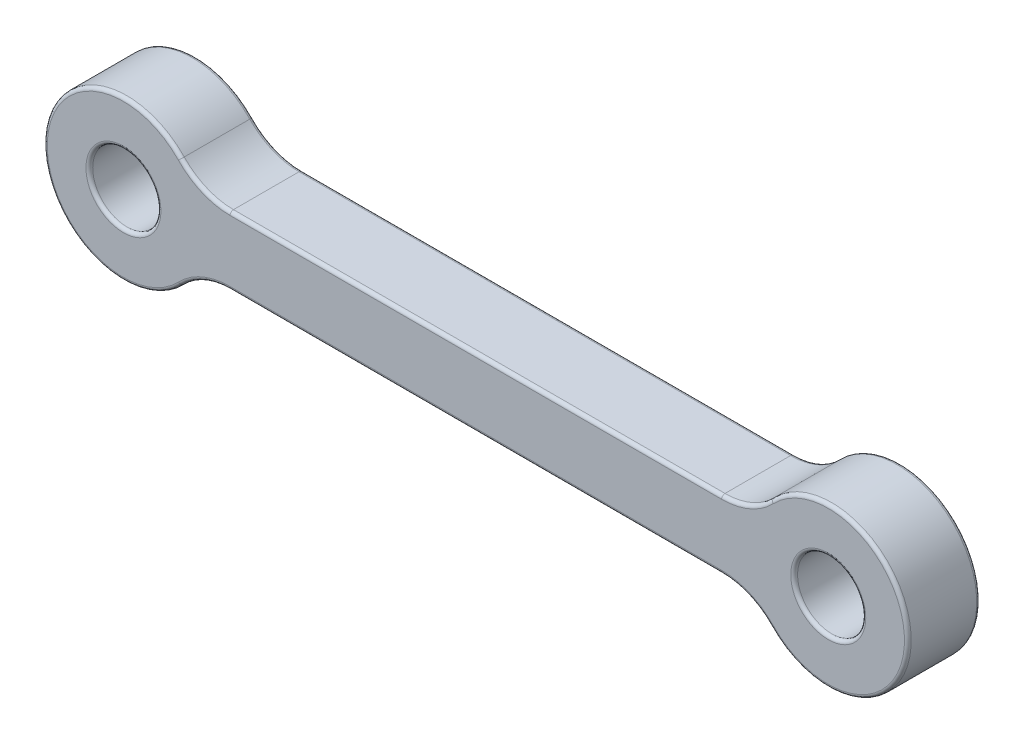
ISO-10303-21;
HEADER;
FILE_DESCRIPTION(('STEP AP214'),'2;1');
FILE_NAME('part.step','',(''),(''),'','','');
FILE_SCHEMA(('AUTOMOTIVE_DESIGN { 1 0 10303 214 1 1 1 1 }'));
ENDSEC;
DATA;
#1=APPLICATION_CONTEXT('core data for automotive mechanical design processes');
#2=APPLICATION_PROTOCOL_DEFINITION('international standard','automotive_design',2000,#1);
#3=PRODUCT_CONTEXT('',#1,'mechanical');
#4=PRODUCT('Part','Part','',(#3));
#5=PRODUCT_RELATED_PRODUCT_CATEGORY('part','',(#4));
#6=PRODUCT_DEFINITION_FORMATION('','',#4);
#7=PRODUCT_DEFINITION_CONTEXT('part definition',#1,'design');
#8=PRODUCT_DEFINITION('design','',#6,#7);
#9=PRODUCT_DEFINITION_SHAPE('','',#8);
#10=(LENGTH_UNIT() NAMED_UNIT(*) SI_UNIT(.MILLI.,.METRE.));
#11=(NAMED_UNIT(*) PLANE_ANGLE_UNIT() SI_UNIT($,.RADIAN.));
#12=(NAMED_UNIT(*) SI_UNIT($,.STERADIAN.) SOLID_ANGLE_UNIT());
#13=UNCERTAINTY_MEASURE_WITH_UNIT(LENGTH_MEASURE(1.E-05),#10,'distance_accuracy_value','');
#14=(GEOMETRIC_REPRESENTATION_CONTEXT(3) GLOBAL_UNCERTAINTY_ASSIGNED_CONTEXT((#13)) GLOBAL_UNIT_ASSIGNED_CONTEXT((#10,
#11,#12)) REPRESENTATION_CONTEXT('',''));
#15=CARTESIAN_POINT('',(0.,0.,0.));
#16=DIRECTION('',(0.,0.,1.));
#17=DIRECTION('',(1.,0.,0.));
#18=AXIS2_PLACEMENT_3D('',#15,#16,#17);
#19=CARTESIAN_POINT('',(0.,1.5,3.18));
#20=DIRECTION('',(0.,-1.,0.));
#21=DIRECTION('',(0.,0.,-1.));
#22=AXIS2_PLACEMENT_3D('',#19,#20,#21);
#23=PLANE('',#22);
#24=DIRECTION('',(0.,0.,1.));
#25=VECTOR('',#24,1.);
#26=CARTESIAN_POINT('',(4.69041575982343,1.5,3.18));
#27=LINE('',#26,#25);
#28=CARTESIAN_POINT('',(4.69041575982343,1.5,0.15));
#29=VERTEX_POINT('',#28);
#30=CARTESIAN_POINT('',(4.69041575982343,1.5,3.03));
#31=VERTEX_POINT('',#30);
#32=EDGE_CURVE('E262',#29,#31,#27,.T.);
#33=ORIENTED_EDGE('',*,*,#32,.T.);
#34=DIRECTION('',(-1.,0.,0.));
#35=VECTOR('',#34,1.);
#36=CARTESIAN_POINT('',(26.3095842401766,1.5,3.03));
#37=LINE('',#36,#35);
#38=CARTESIAN_POINT('',(26.3095842401766,1.5,3.03));
#39=VERTEX_POINT('',#38);
#40=EDGE_CURVE('E219',#31,#39,#37,.F.);
#41=ORIENTED_EDGE('',*,*,#40,.T.);
#42=DIRECTION('',(0.,0.,-1.));
#43=VECTOR('',#42,1.);
#44=CARTESIAN_POINT('',(26.3095842401766,1.5,3.18));
#45=LINE('',#44,#43);
#46=CARTESIAN_POINT('',(26.3095842401766,1.5,0.15));
#47=VERTEX_POINT('',#46);
#48=EDGE_CURVE('E306',#39,#47,#45,.T.);
#49=ORIENTED_EDGE('',*,*,#48,.T.);
#50=DIRECTION('',(-1.,0.,0.));
#51=VECTOR('',#50,1.);
#52=CARTESIAN_POINT('',(0.,1.5,0.15));
#53=LINE('',#52,#51);
#54=EDGE_CURVE('E217',#47,#29,#53,.T.);
#55=ORIENTED_EDGE('',*,*,#54,.T.);
#56=EDGE_LOOP('',(#33,#41,#49,#55));
#57=FACE_BOUND('',#56,.T.);
#58=ADVANCED_FACE('F33',(#57),#23,.F.);
#59=CARTESIAN_POINT('',(0.,0.,3.18));
#60=DIRECTION('',(0.,0.,-1.));
#61=DIRECTION('',(-1.,0.,0.));
#62=AXIS2_PLACEMENT_3D('',#59,#60,#61);
#63=CYLINDRICAL_SURFACE('',#62,3.5);
#64=DIRECTION('',(0.,0.,-1.));
#65=VECTOR('',#64,1.);
#66=CARTESIAN_POINT('',(2.52560848605877,-2.42307692307692,3.18));
#67=LINE('',#66,#65);
#68=CARTESIAN_POINT('',(2.52560848605877,-2.42307692307692,0.150000000000001));
#69=VERTEX_POINT('',#68);
#70=CARTESIAN_POINT('',(2.52560848605877,-2.42307692307692,3.03));
#71=VERTEX_POINT('',#70);
#72=EDGE_CURVE('E308',#69,#71,#67,.F.);
#73=ORIENTED_EDGE('',*,*,#72,.T.);
#74=CARTESIAN_POINT('',(0.,0.,3.03));
#75=DIRECTION('',(0.,0.,1.));
#76=DIRECTION('',(1.,0.,0.));
#77=AXIS2_PLACEMENT_3D('',#74,#75,#76);
#78=CIRCLE('',#77,3.5);
#79=CARTESIAN_POINT('',(2.52560848605877,2.42307692307692,3.03));
#80=VERTEX_POINT('',#79);
#81=EDGE_CURVE('E210',#71,#80,#78,.F.);
#82=ORIENTED_EDGE('',*,*,#81,.T.);
#83=DIRECTION('',(0.,0.,-1.));
#84=VECTOR('',#83,1.);
#85=CARTESIAN_POINT('',(2.52560848605877,2.42307692307692,3.18));
#86=LINE('',#85,#84);
#87=CARTESIAN_POINT('',(2.52560848605877,2.42307692307692,0.150000000000001));
#88=VERTEX_POINT('',#87);
#89=EDGE_CURVE('E316',#80,#88,#86,.T.);
#90=ORIENTED_EDGE('',*,*,#89,.T.);
#91=CARTESIAN_POINT('',(0.,0.,0.15));
#92=DIRECTION('',(0.,0.,1.));
#93=DIRECTION('',(1.,0.,0.));
#94=AXIS2_PLACEMENT_3D('',#91,#92,#93);
#95=CIRCLE('',#94,3.5);
#96=EDGE_CURVE('E208',#88,#69,#95,.T.);
#97=ORIENTED_EDGE('',*,*,#96,.T.);
#98=EDGE_LOOP('',(#73,#82,#90,#97));
#99=FACE_BOUND('',#98,.T.);
#100=ADVANCED_FACE('F385',(#99),#63,.T.);
#101=CARTESIAN_POINT('',(0.,-1.5,3.18));
#102=DIRECTION('',(0.,-1.,0.));
#103=DIRECTION('',(0.,0.,-1.));
#104=AXIS2_PLACEMENT_3D('',#101,#102,#103);
#105=PLANE('',#104);
#106=DIRECTION('',(0.,0.,1.));
#107=VECTOR('',#106,1.);
#108=CARTESIAN_POINT('',(26.3095842401766,-1.5,3.18));
#109=LINE('',#108,#107);
#110=CARTESIAN_POINT('',(26.3095842401766,-1.5,0.15));
#111=VERTEX_POINT('',#110);
#112=CARTESIAN_POINT('',(26.3095842401766,-1.5,3.03));
#113=VERTEX_POINT('',#112);
#114=EDGE_CURVE('E168',#111,#113,#109,.T.);
#115=ORIENTED_EDGE('',*,*,#114,.T.);
#116=DIRECTION('',(-1.,0.,0.));
#117=VECTOR('',#116,1.);
#118=CARTESIAN_POINT('',(0.,-1.5,3.03));
#119=LINE('',#118,#117);
#120=CARTESIAN_POINT('',(4.69041575982343,-1.5,3.03));
#121=VERTEX_POINT('',#120);
#122=EDGE_CURVE('E202',#113,#121,#119,.T.);
#123=ORIENTED_EDGE('',*,*,#122,.T.);
#124=DIRECTION('',(0.,0.,-1.));
#125=VECTOR('',#124,1.);
#126=CARTESIAN_POINT('',(4.69041575982343,-1.5,3.18));
#127=LINE('',#126,#125);
#128=CARTESIAN_POINT('',(4.69041575982343,-1.5,0.15));
#129=VERTEX_POINT('',#128);
#130=EDGE_CURVE('E319',#121,#129,#127,.T.);
#131=ORIENTED_EDGE('',*,*,#130,.T.);
#132=DIRECTION('',(-1.,0.,0.));
#133=VECTOR('',#132,1.);
#134=CARTESIAN_POINT('',(26.3095842401766,-1.5,0.15));
#135=LINE('',#134,#133);
#136=EDGE_CURVE('E200',#129,#111,#135,.F.);
#137=ORIENTED_EDGE('',*,*,#136,.T.);
#138=EDGE_LOOP('',(#115,#123,#131,#137));
#139=FACE_BOUND('',#138,.T.);
#140=ADVANCED_FACE('F341',(#139),#105,.T.);
#141=CARTESIAN_POINT('',(0.,0.,3.18));
#142=DIRECTION('',(0.,0.,-1.));
#143=DIRECTION('',(-1.,0.,0.));
#144=AXIS2_PLACEMENT_3D('',#141,#142,#143);
#145=CYLINDRICAL_SURFACE('',#144,1.5);
#146=CARTESIAN_POINT('',(0.,0.,3.03));
#147=DIRECTION('',(0.,0.,1.));
#148=DIRECTION('',(1.,0.,0.));
#149=AXIS2_PLACEMENT_3D('',#146,#147,#148);
#150=CIRCLE('',#149,1.5);
#151=CARTESIAN_POINT('',(-1.5,0.,3.03));
#152=VERTEX_POINT('',#151);
#153=EDGE_CURVE('E194',#152,#152,#150,.T.);
#154=CARTESIAN_POINT('',(0.,0.,0.15));
#155=DIRECTION('',(0.,0.,1.));
#156=DIRECTION('',(1.,0.,0.));
#157=AXIS2_PLACEMENT_3D('',#154,#155,#156);
#158=CIRCLE('',#157,1.5);
#159=CARTESIAN_POINT('',(-1.5,0.,0.15));
#160=VERTEX_POINT('',#159);
#161=EDGE_CURVE('E191',#160,#160,#158,.F.);
#162=CARTESIAN_POINT('',(-1.5,0.,3.03));
#163=CARTESIAN_POINT('',(-1.5,0.,3.));
#164=CARTESIAN_POINT('',(-1.5,0.,2.97));
#165=CARTESIAN_POINT('',(-1.5,0.,2.91));
#166=CARTESIAN_POINT('',(-1.5,0.,2.88));
#167=CARTESIAN_POINT('',(-1.5,0.,2.82));
#168=CARTESIAN_POINT('',(-1.5,0.,2.79));
#169=CARTESIAN_POINT('',(-1.5,0.,2.73));
#170=CARTESIAN_POINT('',(-1.5,0.,2.7));
#171=CARTESIAN_POINT('',(-1.5,0.,2.64));
#172=CARTESIAN_POINT('',(-1.5,0.,2.61));
#173=CARTESIAN_POINT('',(-1.5,0.,2.55));
#174=CARTESIAN_POINT('',(-1.5,0.,2.52));
#175=CARTESIAN_POINT('',(-1.5,0.,2.46));
#176=CARTESIAN_POINT('',(-1.5,0.,2.43));
#177=CARTESIAN_POINT('',(-1.5,0.,2.37));
#178=CARTESIAN_POINT('',(-1.5,0.,2.34));
#179=CARTESIAN_POINT('',(-1.5,0.,2.28));
#180=CARTESIAN_POINT('',(-1.5,0.,2.25));
#181=CARTESIAN_POINT('',(-1.5,0.,2.19));
#182=CARTESIAN_POINT('',(-1.5,0.,2.16));
#183=CARTESIAN_POINT('',(-1.5,0.,2.1));
#184=CARTESIAN_POINT('',(-1.5,0.,2.07));
#185=CARTESIAN_POINT('',(-1.5,0.,2.01));
#186=CARTESIAN_POINT('',(-1.5,0.,1.98));
#187=CARTESIAN_POINT('',(-1.5,0.,1.92));
#188=CARTESIAN_POINT('',(-1.5,0.,1.89));
#189=CARTESIAN_POINT('',(-1.5,0.,1.83));
#190=CARTESIAN_POINT('',(-1.5,0.,1.8));
#191=CARTESIAN_POINT('',(-1.5,0.,1.74));
#192=CARTESIAN_POINT('',(-1.5,0.,1.71));
#193=CARTESIAN_POINT('',(-1.5,0.,1.65));
#194=CARTESIAN_POINT('',(-1.5,0.,1.62));
#195=CARTESIAN_POINT('',(-1.5,0.,1.56));
#196=CARTESIAN_POINT('',(-1.5,0.,1.53));
#197=CARTESIAN_POINT('',(-1.5,0.,1.47));
#198=CARTESIAN_POINT('',(-1.5,0.,1.44));
#199=CARTESIAN_POINT('',(-1.5,0.,1.38));
#200=CARTESIAN_POINT('',(-1.5,0.,1.35));
#201=CARTESIAN_POINT('',(-1.5,0.,1.29));
#202=CARTESIAN_POINT('',(-1.5,0.,1.26));
#203=CARTESIAN_POINT('',(-1.5,0.,1.2));
#204=CARTESIAN_POINT('',(-1.5,0.,1.17));
#205=CARTESIAN_POINT('',(-1.5,0.,1.11));
#206=CARTESIAN_POINT('',(-1.5,0.,1.08));
#207=CARTESIAN_POINT('',(-1.5,0.,1.02));
#208=CARTESIAN_POINT('',(-1.5,0.,0.99));
#209=CARTESIAN_POINT('',(-1.5,0.,0.93));
#210=CARTESIAN_POINT('',(-1.5,0.,0.9));
#211=CARTESIAN_POINT('',(-1.5,0.,0.84));
#212=CARTESIAN_POINT('',(-1.5,0.,0.81));
#213=CARTESIAN_POINT('',(-1.5,0.,0.75));
#214=CARTESIAN_POINT('',(-1.5,0.,0.72));
#215=CARTESIAN_POINT('',(-1.5,0.,0.66));
#216=CARTESIAN_POINT('',(-1.5,0.,0.63));
#217=CARTESIAN_POINT('',(-1.5,0.,0.57));
#218=CARTESIAN_POINT('',(-1.5,0.,0.54));
#219=CARTESIAN_POINT('',(-1.5,0.,0.48));
#220=CARTESIAN_POINT('',(-1.5,0.,0.45));
#221=CARTESIAN_POINT('',(-1.5,0.,0.39));
#222=CARTESIAN_POINT('',(-1.5,0.,0.36));
#223=CARTESIAN_POINT('',(-1.5,0.,0.3));
#224=CARTESIAN_POINT('',(-1.5,0.,0.27));
#225=CARTESIAN_POINT('',(-1.5,0.,0.21));
#226=CARTESIAN_POINT('',(-1.5,0.,0.18));
#227=CARTESIAN_POINT('',(-1.5,0.,0.15));
#228=B_SPLINE_CURVE_WITH_KNOTS('',3,(#162,#163,#164,#165,#166,#167,#168,#169,#170,#171,#172,
#173,#174,#175,#176,#177,#178,#179,#180,#181,#182,#183,#184,#185,#186,#187,#188,#189,#190,#191,
#192,#193,#194,#195,#196,#197,#198,#199,#200,#201,#202,#203,#204,#205,#206,#207,#208,#209,#210,
#211,#212,#213,#214,#215,#216,#217,#218,#219,#220,#221,#222,#223,#224,#225,#226,#227),
.UNSPECIFIED.,.F.,.F.,(4,2,2,2,2,2,2,2,2,2,2,2,2,2,2,2,2,2,2,2,2,2,2,2,2,2,2,2,2,2,2,2,4),(0.,
0.0900000000000002,0.18,0.27,0.36,0.45,0.54,0.63,0.72,0.81,0.9,0.99,1.08,1.17,1.26,1.35,1.44,
1.53,1.62,1.71,1.8,1.89,1.98,2.07,2.16,2.25,2.34,2.43,2.52,2.61,2.7,2.79,2.88),.UNSPECIFIED.);
#229=EDGE_CURVE('BSEAM392',#152,#160,#228,.T.);
#230=ORIENTED_EDGE('',*,*,#153,.T.);
#231=ORIENTED_EDGE('',*,*,#161,.T.);
#232=ORIENTED_EDGE('',*,*,#229,.T.);
#233=ORIENTED_EDGE('',*,*,#229,.F.);
#234=EDGE_LOOP('',(#230,#232,#231,#233));
#235=FACE_BOUND('',#234,.T.);
#236=ADVANCED_FACE('F392',(#235),#145,.F.);
#237=CARTESIAN_POINT('',(31.,0.,3.18));
#238=DIRECTION('',(0.,0.,-1.));
#239=DIRECTION('',(-1.,0.,0.));
#240=AXIS2_PLACEMENT_3D('',#237,#238,#239);
#241=CYLINDRICAL_SURFACE('',#240,3.5);
#242=DIRECTION('',(0.,0.,-1.));
#243=VECTOR('',#242,1.);
#244=CARTESIAN_POINT('',(28.4743915139412,2.42307692307692,3.18));
#245=LINE('',#244,#243);
#246=CARTESIAN_POINT('',(28.4743915139412,2.42307692307692,0.150000000000001));
#247=VERTEX_POINT('',#246);
#248=CARTESIAN_POINT('',(28.4743915139412,2.42307692307692,3.03));
#249=VERTEX_POINT('',#248);
#250=EDGE_CURVE('E305',#247,#249,#245,.F.);
#251=ORIENTED_EDGE('',*,*,#250,.T.);
#252=CARTESIAN_POINT('',(31.,0.,3.03));
#253=DIRECTION('',(0.,0.,1.));
#254=DIRECTION('',(1.,0.,0.));
#255=AXIS2_PLACEMENT_3D('',#252,#253,#254);
#256=CIRCLE('',#255,3.5);
#257=CARTESIAN_POINT('',(28.4743915139412,-2.42307692307692,3.03));
#258=VERTEX_POINT('',#257);
#259=EDGE_CURVE('E227',#249,#258,#256,.F.);
#260=ORIENTED_EDGE('',*,*,#259,.T.);
#261=DIRECTION('',(0.,0.,-1.));
#262=VECTOR('',#261,1.);
#263=CARTESIAN_POINT('',(28.4743915139412,-2.42307692307692,3.18));
#264=LINE('',#263,#262);
#265=CARTESIAN_POINT('',(28.4743915139412,-2.42307692307692,0.150000000000001));
#266=VERTEX_POINT('',#265);
#267=EDGE_CURVE('E299',#258,#266,#264,.T.);
#268=ORIENTED_EDGE('',*,*,#267,.T.);
#269=CARTESIAN_POINT('',(31.,0.,0.15));
#270=DIRECTION('',(0.,0.,1.));
#271=DIRECTION('',(1.,0.,0.));
#272=AXIS2_PLACEMENT_3D('',#269,#270,#271);
#273=CIRCLE('',#272,3.5);
#274=EDGE_CURVE('E225',#266,#247,#273,.T.);
#275=ORIENTED_EDGE('',*,*,#274,.T.);
#276=EDGE_LOOP('',(#251,#260,#268,#275));
#277=FACE_BOUND('',#276,.T.);
#278=ADVANCED_FACE('F303',(#277),#241,.T.);
#279=CARTESIAN_POINT('',(31.,0.,3.18));
#280=DIRECTION('',(0.,0.,-1.));
#281=DIRECTION('',(-1.,0.,0.));
#282=AXIS2_PLACEMENT_3D('',#279,#280,#281);
#283=CYLINDRICAL_SURFACE('',#282,1.5);
#284=CARTESIAN_POINT('',(31.,0.,3.03));
#285=DIRECTION('',(0.,0.,1.));
#286=DIRECTION('',(1.,0.,0.));
#287=AXIS2_PLACEMENT_3D('',#284,#285,#286);
#288=CIRCLE('',#287,1.5);
#289=CARTESIAN_POINT('',(29.5,0.,3.03));
#290=VERTEX_POINT('',#289);
#291=EDGE_CURVE('E188',#290,#290,#288,.T.);
#292=CARTESIAN_POINT('',(31.,0.,0.15));
#293=DIRECTION('',(0.,0.,1.));
#294=DIRECTION('',(1.,0.,0.));
#295=AXIS2_PLACEMENT_3D('',#292,#293,#294);
#296=CIRCLE('',#295,1.5);
#297=CARTESIAN_POINT('',(29.5,0.,0.15));
#298=VERTEX_POINT('',#297);
#299=EDGE_CURVE('E185',#298,#298,#296,.F.);
#300=CARTESIAN_POINT('',(29.5,0.,3.03));
#301=CARTESIAN_POINT('',(29.5,0.,3.));
#302=CARTESIAN_POINT('',(29.5,0.,2.97));
#303=CARTESIAN_POINT('',(29.5,0.,2.91));
#304=CARTESIAN_POINT('',(29.5,0.,2.88));
#305=CARTESIAN_POINT('',(29.5,0.,2.82));
#306=CARTESIAN_POINT('',(29.5,0.,2.79));
#307=CARTESIAN_POINT('',(29.5,0.,2.73));
#308=CARTESIAN_POINT('',(29.5,0.,2.7));
#309=CARTESIAN_POINT('',(29.5,0.,2.64));
#310=CARTESIAN_POINT('',(29.5,0.,2.61));
#311=CARTESIAN_POINT('',(29.5,0.,2.55));
#312=CARTESIAN_POINT('',(29.5,0.,2.52));
#313=CARTESIAN_POINT('',(29.5,0.,2.46));
#314=CARTESIAN_POINT('',(29.5,0.,2.43));
#315=CARTESIAN_POINT('',(29.5,0.,2.37));
#316=CARTESIAN_POINT('',(29.5,0.,2.34));
#317=CARTESIAN_POINT('',(29.5,0.,2.28));
#318=CARTESIAN_POINT('',(29.5,0.,2.25));
#319=CARTESIAN_POINT('',(29.5,0.,2.19));
#320=CARTESIAN_POINT('',(29.5,0.,2.16));
#321=CARTESIAN_POINT('',(29.5,0.,2.1));
#322=CARTESIAN_POINT('',(29.5,0.,2.07));
#323=CARTESIAN_POINT('',(29.5,0.,2.01));
#324=CARTESIAN_POINT('',(29.5,0.,1.98));
#325=CARTESIAN_POINT('',(29.5,0.,1.92));
#326=CARTESIAN_POINT('',(29.5,0.,1.89));
#327=CARTESIAN_POINT('',(29.5,0.,1.83));
#328=CARTESIAN_POINT('',(29.5,0.,1.8));
#329=CARTESIAN_POINT('',(29.5,0.,1.74));
#330=CARTESIAN_POINT('',(29.5,0.,1.71));
#331=CARTESIAN_POINT('',(29.5,0.,1.65));
#332=CARTESIAN_POINT('',(29.5,0.,1.62));
#333=CARTESIAN_POINT('',(29.5,0.,1.56));
#334=CARTESIAN_POINT('',(29.5,0.,1.53));
#335=CARTESIAN_POINT('',(29.5,0.,1.47));
#336=CARTESIAN_POINT('',(29.5,0.,1.44));
#337=CARTESIAN_POINT('',(29.5,0.,1.38));
#338=CARTESIAN_POINT('',(29.5,0.,1.35));
#339=CARTESIAN_POINT('',(29.5,0.,1.29));
#340=CARTESIAN_POINT('',(29.5,0.,1.26));
#341=CARTESIAN_POINT('',(29.5,0.,1.2));
#342=CARTESIAN_POINT('',(29.5,0.,1.17));
#343=CARTESIAN_POINT('',(29.5,0.,1.11));
#344=CARTESIAN_POINT('',(29.5,0.,1.08));
#345=CARTESIAN_POINT('',(29.5,0.,1.02));
#346=CARTESIAN_POINT('',(29.5,0.,0.99));
#347=CARTESIAN_POINT('',(29.5,0.,0.93));
#348=CARTESIAN_POINT('',(29.5,0.,0.9));
#349=CARTESIAN_POINT('',(29.5,0.,0.84));
#350=CARTESIAN_POINT('',(29.5,0.,0.81));
#351=CARTESIAN_POINT('',(29.5,0.,0.75));
#352=CARTESIAN_POINT('',(29.5,0.,0.72));
#353=CARTESIAN_POINT('',(29.5,0.,0.66));
#354=CARTESIAN_POINT('',(29.5,0.,0.63));
#355=CARTESIAN_POINT('',(29.5,0.,0.57));
#356=CARTESIAN_POINT('',(29.5,0.,0.54));
#357=CARTESIAN_POINT('',(29.5,0.,0.48));
#358=CARTESIAN_POINT('',(29.5,0.,0.45));
#359=CARTESIAN_POINT('',(29.5,0.,0.39));
#360=CARTESIAN_POINT('',(29.5,0.,0.36));
#361=CARTESIAN_POINT('',(29.5,0.,0.3));
#362=CARTESIAN_POINT('',(29.5,0.,0.27));
#363=CARTESIAN_POINT('',(29.5,0.,0.21));
#364=CARTESIAN_POINT('',(29.5,0.,0.18));
#365=CARTESIAN_POINT('',(29.5,0.,0.15));
#366=B_SPLINE_CURVE_WITH_KNOTS('',3,(#300,#301,#302,#303,#304,#305,#306,#307,#308,#309,#310,
#311,#312,#313,#314,#315,#316,#317,#318,#319,#320,#321,#322,#323,#324,#325,#326,#327,#328,#329,
#330,#331,#332,#333,#334,#335,#336,#337,#338,#339,#340,#341,#342,#343,#344,#345,#346,#347,#348,
#349,#350,#351,#352,#353,#354,#355,#356,#357,#358,#359,#360,#361,#362,#363,#364,#365),
.UNSPECIFIED.,.F.,.F.,(4,2,2,2,2,2,2,2,2,2,2,2,2,2,2,2,2,2,2,2,2,2,2,2,2,2,2,2,2,2,2,2,4),(0.,
0.0900000000000002,0.18,0.27,0.36,0.45,0.54,0.63,0.72,0.81,0.9,0.99,1.08,1.17,1.26,1.35,1.44,
1.53,1.62,1.71,1.8,1.89,1.98,2.07,2.16,2.25,2.34,2.43,2.52,2.61,2.7,2.79,2.88),.UNSPECIFIED.);
#367=EDGE_CURVE('BSEAM538',#290,#298,#366,.T.);
#368=ORIENTED_EDGE('',*,*,#291,.T.);
#369=ORIENTED_EDGE('',*,*,#299,.T.);
#370=ORIENTED_EDGE('',*,*,#367,.T.);
#371=ORIENTED_EDGE('',*,*,#367,.F.);
#372=EDGE_LOOP('',(#368,#370,#369,#371));
#373=FACE_BOUND('',#372,.T.);
#374=ADVANCED_FACE('F538',(#373),#283,.F.);
#375=CARTESIAN_POINT('',(0.,0.,3.18));
#376=DIRECTION('',(0.,0.,1.));
#377=DIRECTION('',(1.,0.,0.));
#378=AXIS2_PLACEMENT_3D('',#375,#376,#377);
#379=PLANE('',#378);
#380=CARTESIAN_POINT('',(31.,0.,3.18));
#381=DIRECTION('',(0.,0.,1.));
#382=DIRECTION('',(1.,0.,0.));
#383=AXIS2_PLACEMENT_3D('',#380,#381,#382);
#384=CIRCLE('',#383,1.65);
#385=CARTESIAN_POINT('',(32.65,0.,3.18));
#386=VERTEX_POINT('',#385);
#387=EDGE_CURVE('E177',#386,#386,#384,.F.);
#388=ORIENTED_EDGE('',*,*,#387,.T.);
#389=EDGE_LOOP('',(#388));
#390=FACE_BOUND('',#389,.T.);
#391=CARTESIAN_POINT('',(0.,0.,3.18));
#392=DIRECTION('',(0.,0.,1.));
#393=DIRECTION('',(1.,0.,0.));
#394=AXIS2_PLACEMENT_3D('',#391,#392,#393);
#395=CIRCLE('',#394,1.65);
#396=CARTESIAN_POINT('',(1.65,0.,3.18));
#397=VERTEX_POINT('',#396);
#398=EDGE_CURVE('E174',#397,#397,#395,.F.);
#399=ORIENTED_EDGE('',*,*,#398,.T.);
#400=EDGE_LOOP('',(#399));
#401=FACE_BOUND('',#400,.T.);
#402=DIRECTION('',(-1.,0.,0.));
#403=VECTOR('',#402,1.);
#404=CARTESIAN_POINT('',(0.,-1.35,3.18));
#405=LINE('',#404,#403);
#406=CARTESIAN_POINT('',(4.69041575982343,-1.35,3.18));
#407=VERTEX_POINT('',#406);
#408=CARTESIAN_POINT('',(26.3095842401766,-1.35,3.18));
#409=VERTEX_POINT('',#408);
#410=EDGE_CURVE('E172',#407,#409,#405,.F.);
#411=ORIENTED_EDGE('',*,*,#410,.T.);
#412=CARTESIAN_POINT('',(26.3095842401766,-4.5,3.18));
#413=DIRECTION('',(0.,0.,1.));
#414=DIRECTION('',(1.,0.,0.));
#415=AXIS2_PLACEMENT_3D('',#412,#413,#414);
#416=CIRCLE('',#415,3.15);
#417=CARTESIAN_POINT('',(28.5826318776295,-2.31923076923077,3.18));
#418=VERTEX_POINT('',#417);
#419=EDGE_CURVE('E153',#409,#418,#416,.F.);
#420=ORIENTED_EDGE('',*,*,#419,.T.);
#421=CARTESIAN_POINT('',(31.,0.,3.18));
#422=DIRECTION('',(0.,0.,1.));
#423=DIRECTION('',(1.,0.,0.));
#424=AXIS2_PLACEMENT_3D('',#421,#422,#423);
#425=CIRCLE('',#424,3.35);
#426=CARTESIAN_POINT('',(28.5826318776295,2.31923076923077,3.18));
#427=VERTEX_POINT('',#426);
#428=EDGE_CURVE('E161',#418,#427,#425,.T.);
#429=ORIENTED_EDGE('',*,*,#428,.T.);
#430=CARTESIAN_POINT('',(26.3095842401766,4.5,3.18));
#431=DIRECTION('',(0.,0.,1.));
#432=DIRECTION('',(1.,0.,0.));
#433=AXIS2_PLACEMENT_3D('',#430,#431,#432);
#434=CIRCLE('',#433,3.15);
#435=CARTESIAN_POINT('',(26.3095842401766,1.35,3.18));
#436=VERTEX_POINT('',#435);
#437=EDGE_CURVE('E167',#427,#436,#434,.F.);
#438=ORIENTED_EDGE('',*,*,#437,.T.);
#439=DIRECTION('',(-1.,0.,0.));
#440=VECTOR('',#439,1.);
#441=CARTESIAN_POINT('',(4.69041575982343,1.35,3.18));
#442=LINE('',#441,#440);
#443=CARTESIAN_POINT('',(4.69041575982343,1.35,3.18));
#444=VERTEX_POINT('',#443);
#445=EDGE_CURVE('E324',#436,#444,#442,.T.);
#446=ORIENTED_EDGE('',*,*,#445,.T.);
#447=CARTESIAN_POINT('',(4.69041575982343,4.5,3.18));
#448=DIRECTION('',(0.,0.,1.));
#449=DIRECTION('',(1.,0.,0.));
#450=AXIS2_PLACEMENT_3D('',#447,#448,#449);
#451=CIRCLE('',#450,3.15);
#452=CARTESIAN_POINT('',(2.41736812237054,2.31923076923077,3.18));
#453=VERTEX_POINT('',#452);
#454=EDGE_CURVE('E326',#444,#453,#451,.F.);
#455=ORIENTED_EDGE('',*,*,#454,.T.);
#456=CARTESIAN_POINT('',(0.,0.,3.18));
#457=DIRECTION('',(0.,0.,1.));
#458=DIRECTION('',(1.,0.,0.));
#459=AXIS2_PLACEMENT_3D('',#456,#457,#458);
#460=CIRCLE('',#459,3.35);
#461=CARTESIAN_POINT('',(2.41736812237054,-2.31923076923077,3.18));
#462=VERTEX_POINT('',#461);
#463=EDGE_CURVE('E328',#453,#462,#460,.T.);
#464=ORIENTED_EDGE('',*,*,#463,.T.);
#465=CARTESIAN_POINT('',(4.69041575982343,-4.5,3.18));
#466=DIRECTION('',(0.,0.,1.));
#467=DIRECTION('',(1.,0.,0.));
#468=AXIS2_PLACEMENT_3D('',#465,#466,#467);
#469=CIRCLE('',#468,3.15);
#470=EDGE_CURVE('E179',#462,#407,#469,.F.);
#471=ORIENTED_EDGE('',*,*,#470,.T.);
#472=EDGE_LOOP('',(#411,#420,#429,#438,#446,#455,#464,#471));
#473=FACE_BOUND('',#472,.T.);
#474=ADVANCED_FACE('F170',(#390,#401,#473),#379,.T.);
#475=CARTESIAN_POINT('',(0.,0.,0.));
#476=DIRECTION('',(0.,0.,1.));
#477=DIRECTION('',(1.,0.,0.));
#478=AXIS2_PLACEMENT_3D('',#475,#476,#477);
#479=PLANE('',#478);
#480=CARTESIAN_POINT('',(31.,0.,0.));
#481=DIRECTION('',(0.,0.,1.));
#482=DIRECTION('',(1.,0.,0.));
#483=AXIS2_PLACEMENT_3D('',#480,#481,#482);
#484=CIRCLE('',#483,1.65);
#485=CARTESIAN_POINT('',(32.65,0.,0.));
#486=VERTEX_POINT('',#485);
#487=EDGE_CURVE('E11',#486,#486,#484,.T.);
#488=ORIENTED_EDGE('',*,*,#487,.T.);
#489=EDGE_LOOP('',(#488));
#490=FACE_BOUND('',#489,.T.);
#491=CARTESIAN_POINT('',(0.,0.,0.));
#492=DIRECTION('',(0.,0.,1.));
#493=DIRECTION('',(1.,0.,0.));
#494=AXIS2_PLACEMENT_3D('',#491,#492,#493);
#495=CIRCLE('',#494,1.65);
#496=CARTESIAN_POINT('',(1.65,0.,0.));
#497=VERTEX_POINT('',#496);
#498=EDGE_CURVE('E42',#497,#497,#495,.T.);
#499=ORIENTED_EDGE('',*,*,#498,.T.);
#500=EDGE_LOOP('',(#499));
#501=FACE_BOUND('',#500,.T.);
#502=CARTESIAN_POINT('',(0.,0.,0.));
#503=DIRECTION('',(0.,0.,1.));
#504=DIRECTION('',(1.,0.,0.));
#505=AXIS2_PLACEMENT_3D('',#502,#503,#504);
#506=CIRCLE('',#505,3.35);
#507=CARTESIAN_POINT('',(2.41736812237054,-2.31923076923077,0.));
#508=VERTEX_POINT('',#507);
#509=CARTESIAN_POINT('',(2.41736812237054,2.31923076923077,0.));
#510=VERTEX_POINT('',#509);
#511=EDGE_CURVE('E50',#508,#510,#506,.F.);
#512=ORIENTED_EDGE('',*,*,#511,.T.);
#513=CARTESIAN_POINT('',(4.69041575982343,4.5,0.));
#514=DIRECTION('',(0.,0.,1.));
#515=DIRECTION('',(1.,0.,0.));
#516=AXIS2_PLACEMENT_3D('',#513,#514,#515);
#517=CIRCLE('',#516,3.15);
#518=CARTESIAN_POINT('',(4.69041575982343,1.35,0.));
#519=VERTEX_POINT('',#518);
#520=EDGE_CURVE('E241',#510,#519,#517,.T.);
#521=ORIENTED_EDGE('',*,*,#520,.T.);
#522=DIRECTION('',(-1.,0.,0.));
#523=VECTOR('',#522,1.);
#524=CARTESIAN_POINT('',(0.,1.35,0.));
#525=LINE('',#524,#523);
#526=CARTESIAN_POINT('',(26.3095842401766,1.35,0.));
#527=VERTEX_POINT('',#526);
#528=EDGE_CURVE('E229',#519,#527,#525,.F.);
#529=ORIENTED_EDGE('',*,*,#528,.T.);
#530=CARTESIAN_POINT('',(26.3095842401766,4.5,0.));
#531=DIRECTION('',(0.,0.,1.));
#532=DIRECTION('',(1.,0.,0.));
#533=AXIS2_PLACEMENT_3D('',#530,#531,#532);
#534=CIRCLE('',#533,3.15);
#535=CARTESIAN_POINT('',(28.5826318776295,2.31923076923076,0.));
#536=VERTEX_POINT('',#535);
#537=EDGE_CURVE('E231',#527,#536,#534,.T.);
#538=ORIENTED_EDGE('',*,*,#537,.T.);
#539=CARTESIAN_POINT('',(31.,0.,0.));
#540=DIRECTION('',(0.,0.,1.));
#541=DIRECTION('',(1.,0.,0.));
#542=AXIS2_PLACEMENT_3D('',#539,#540,#541);
#543=CIRCLE('',#542,3.35);
#544=CARTESIAN_POINT('',(28.5826318776295,-2.31923076923077,0.));
#545=VERTEX_POINT('',#544);
#546=EDGE_CURVE('E233',#536,#545,#543,.F.);
#547=ORIENTED_EDGE('',*,*,#546,.T.);
#548=CARTESIAN_POINT('',(26.3095842401766,-4.5,0.));
#549=DIRECTION('',(0.,0.,1.));
#550=DIRECTION('',(1.,0.,0.));
#551=AXIS2_PLACEMENT_3D('',#548,#549,#550);
#552=CIRCLE('',#551,3.15);
#553=CARTESIAN_POINT('',(26.3095842401766,-1.35,0.));
#554=VERTEX_POINT('',#553);
#555=EDGE_CURVE('E235',#545,#554,#552,.T.);
#556=ORIENTED_EDGE('',*,*,#555,.T.);
#557=DIRECTION('',(-1.,0.,0.));
#558=VECTOR('',#557,1.);
#559=CARTESIAN_POINT('',(4.69041575982343,-1.35,0.));
#560=LINE('',#559,#558);
#561=CARTESIAN_POINT('',(4.69041575982343,-1.35,0.));
#562=VERTEX_POINT('',#561);
#563=EDGE_CURVE('E237',#554,#562,#560,.T.);
#564=ORIENTED_EDGE('',*,*,#563,.T.);
#565=CARTESIAN_POINT('',(4.69041575982343,-4.5,0.));
#566=DIRECTION('',(0.,0.,1.));
#567=DIRECTION('',(1.,0.,0.));
#568=AXIS2_PLACEMENT_3D('',#565,#566,#567);
#569=CIRCLE('',#568,3.15);
#570=EDGE_CURVE('E55',#562,#508,#569,.T.);
#571=ORIENTED_EDGE('',*,*,#570,.T.);
#572=EDGE_LOOP('',(#512,#521,#529,#538,#547,#556,#564,#571));
#573=FACE_BOUND('',#572,.T.);
#574=ADVANCED_FACE('F357',(#490,#501,#573),#479,.F.);
#575=CARTESIAN_POINT('',(26.3095842401766,4.5,3.18));
#576=DIRECTION('',(0.,0.,-1.));
#577=DIRECTION('',(-1.,0.,0.));
#578=AXIS2_PLACEMENT_3D('',#575,#576,#577);
#579=CYLINDRICAL_SURFACE('',#578,3.);
#580=ORIENTED_EDGE('',*,*,#48,.F.);
#581=CARTESIAN_POINT('',(26.3095842401766,4.5,3.03));
#582=DIRECTION('',(0.,0.,1.));
#583=DIRECTION('',(1.,0.,0.));
#584=AXIS2_PLACEMENT_3D('',#581,#582,#583);
#585=CIRCLE('',#584,3.);
#586=EDGE_CURVE('E223',#39,#249,#585,.T.);
#587=ORIENTED_EDGE('',*,*,#586,.T.);
#588=ORIENTED_EDGE('',*,*,#250,.F.);
#589=CARTESIAN_POINT('',(26.3095842401766,4.5,0.15));
#590=DIRECTION('',(0.,0.,1.));
#591=DIRECTION('',(1.,0.,0.));
#592=AXIS2_PLACEMENT_3D('',#589,#590,#591);
#593=CIRCLE('',#592,3.);
#594=EDGE_CURVE('E221',#247,#47,#593,.F.);
#595=ORIENTED_EDGE('',*,*,#594,.T.);
#596=EDGE_LOOP('',(#580,#587,#588,#595));
#597=FACE_BOUND('',#596,.T.);
#598=ADVANCED_FACE('F397',(#597),#579,.F.);
#599=CARTESIAN_POINT('',(4.69041575982343,4.5,3.18));
#600=DIRECTION('',(0.,0.,-1.));
#601=DIRECTION('',(-1.,0.,0.));
#602=AXIS2_PLACEMENT_3D('',#599,#600,#601);
#603=CYLINDRICAL_SURFACE('',#602,3.);
#604=ORIENTED_EDGE('',*,*,#89,.F.);
#605=CARTESIAN_POINT('',(4.69041575982343,4.5,3.03));
#606=DIRECTION('',(0.,0.,1.));
#607=DIRECTION('',(1.,0.,0.));
#608=AXIS2_PLACEMENT_3D('',#605,#606,#607);
#609=CIRCLE('',#608,3.);
#610=EDGE_CURVE('E215',#80,#31,#609,.T.);
#611=ORIENTED_EDGE('',*,*,#610,.T.);
#612=ORIENTED_EDGE('',*,*,#32,.F.);
#613=CARTESIAN_POINT('',(4.69041575982343,4.5,0.15));
#614=DIRECTION('',(0.,0.,1.));
#615=DIRECTION('',(1.,0.,0.));
#616=AXIS2_PLACEMENT_3D('',#613,#614,#615);
#617=CIRCLE('',#616,3.);
#618=EDGE_CURVE('E212',#29,#88,#617,.F.);
#619=ORIENTED_EDGE('',*,*,#618,.T.);
#620=EDGE_LOOP('',(#604,#611,#612,#619));
#621=FACE_BOUND('',#620,.T.);
#622=ADVANCED_FACE('F374',(#621),#603,.F.);
#623=CARTESIAN_POINT('',(26.3095842401766,-4.5,3.18));
#624=DIRECTION('',(0.,0.,-1.));
#625=DIRECTION('',(-1.,0.,0.));
#626=AXIS2_PLACEMENT_3D('',#623,#624,#625);
#627=CYLINDRICAL_SURFACE('',#626,3.);
#628=ORIENTED_EDGE('',*,*,#267,.F.);
#629=CARTESIAN_POINT('',(26.3095842401766,-4.5,3.03));
#630=DIRECTION('',(0.,0.,1.));
#631=DIRECTION('',(1.,0.,0.));
#632=AXIS2_PLACEMENT_3D('',#629,#630,#631);
#633=CIRCLE('',#632,3.);
#634=EDGE_CURVE('E155',#258,#113,#633,.T.);
#635=ORIENTED_EDGE('',*,*,#634,.T.);
#636=ORIENTED_EDGE('',*,*,#114,.F.);
#637=CARTESIAN_POINT('',(26.3095842401766,-4.5,0.15));
#638=DIRECTION('',(0.,0.,1.));
#639=DIRECTION('',(1.,0.,0.));
#640=AXIS2_PLACEMENT_3D('',#637,#638,#639);
#641=CIRCLE('',#640,3.);
#642=EDGE_CURVE('E197',#111,#266,#641,.F.);
#643=ORIENTED_EDGE('',*,*,#642,.T.);
#644=EDGE_LOOP('',(#628,#635,#636,#643));
#645=FACE_BOUND('',#644,.T.);
#646=ADVANCED_FACE('F298',(#645),#627,.F.);
#647=CARTESIAN_POINT('',(4.69041575982343,-4.5,3.18));
#648=DIRECTION('',(0.,0.,-1.));
#649=DIRECTION('',(-1.,0.,0.));
#650=AXIS2_PLACEMENT_3D('',#647,#648,#649);
#651=CYLINDRICAL_SURFACE('',#650,3.);
#652=ORIENTED_EDGE('',*,*,#130,.F.);
#653=CARTESIAN_POINT('',(4.69041575982343,-4.5,3.03));
#654=DIRECTION('',(0.,0.,1.));
#655=DIRECTION('',(1.,0.,0.));
#656=AXIS2_PLACEMENT_3D('',#653,#654,#655);
#657=CIRCLE('',#656,3.);
#658=EDGE_CURVE('E206',#121,#71,#657,.T.);
#659=ORIENTED_EDGE('',*,*,#658,.T.);
#660=ORIENTED_EDGE('',*,*,#72,.F.);
#661=CARTESIAN_POINT('',(4.69041575982343,-4.5,0.15));
#662=DIRECTION('',(0.,0.,1.));
#663=DIRECTION('',(1.,0.,0.));
#664=AXIS2_PLACEMENT_3D('',#661,#662,#663);
#665=CIRCLE('',#664,3.);
#666=EDGE_CURVE('E204',#69,#129,#665,.F.);
#667=ORIENTED_EDGE('',*,*,#666,.T.);
#668=EDGE_LOOP('',(#652,#659,#660,#667));
#669=FACE_BOUND('',#668,.T.);
#670=ADVANCED_FACE('F343',(#669),#651,.F.);
#671=CARTESIAN_POINT('',(31.,0.,3.03));
#672=DIRECTION('',(0.,0.,1.));
#673=DIRECTION('',(1.,0.,0.));
#674=AXIS2_PLACEMENT_3D('',#671,#672,#673);
#675=TOROIDAL_SURFACE('',#674,1.65,0.15);
#676=ORIENTED_EDGE('',*,*,#291,.F.);
#677=EDGE_LOOP('',(#676));
#678=FACE_BOUND('',#677,.T.);
#679=ORIENTED_EDGE('',*,*,#387,.F.);
#680=EDGE_LOOP('',(#679));
#681=FACE_BOUND('',#680,.T.);
#682=ADVANCED_FACE('F407',(#678,#681),#675,.T.);
#683=CARTESIAN_POINT('',(0.,0.,3.03));
#684=DIRECTION('',(0.,0.,1.));
#685=DIRECTION('',(1.,0.,0.));
#686=AXIS2_PLACEMENT_3D('',#683,#684,#685);
#687=TOROIDAL_SURFACE('',#686,1.65,0.15);
#688=ORIENTED_EDGE('',*,*,#398,.F.);
#689=EDGE_LOOP('',(#688));
#690=FACE_BOUND('',#689,.T.);
#691=ORIENTED_EDGE('',*,*,#153,.F.);
#692=EDGE_LOOP('',(#691));
#693=FACE_BOUND('',#692,.T.);
#694=ADVANCED_FACE('F410',(#690,#693),#687,.T.);
#695=CARTESIAN_POINT('',(4.69041575982343,4.5,3.03));
#696=DIRECTION('',(0.,0.,1.));
#697=DIRECTION('',(1.,0.,0.));
#698=AXIS2_PLACEMENT_3D('',#695,#696,#697);
#699=TOROIDAL_SURFACE('',#698,3.15,0.15);
#700=CARTESIAN_POINT('',(4.69041575982343,1.35,3.03));
#701=DIRECTION('',(1.,0.,0.));
#702=DIRECTION('',(0.,0.,-1.));
#703=AXIS2_PLACEMENT_3D('',#700,#701,#702);
#704=CIRCLE('',#703,0.15);
#705=EDGE_CURVE('E256',#31,#444,#704,.T.);
#706=ORIENTED_EDGE('',*,*,#705,.F.);
#707=ORIENTED_EDGE('',*,*,#610,.F.);
#708=CARTESIAN_POINT('',(2.41736812237054,2.31923076923077,3.03));
#709=DIRECTION('',(-0.692307692307693,0.72160242458822,0.));
#710=DIRECTION('',(-0.72160242458822,-0.692307692307693,0.));
#711=AXIS2_PLACEMENT_3D('',#708,#709,#710);
#712=CIRCLE('',#711,0.15);
#713=EDGE_CURVE('E259',#453,#80,#712,.T.);
#714=ORIENTED_EDGE('',*,*,#713,.F.);
#715=ORIENTED_EDGE('',*,*,#454,.F.);
#716=EDGE_LOOP('',(#706,#707,#714,#715));
#717=FACE_BOUND('',#716,.T.);
#718=ADVANCED_FACE('F378',(#717),#699,.T.);
#719=CARTESIAN_POINT('',(0.,0.,3.03));
#720=DIRECTION('',(0.,0.,1.));
#721=DIRECTION('',(1.,0.,0.));
#722=AXIS2_PLACEMENT_3D('',#719,#720,#721);
#723=TOROIDAL_SURFACE('',#722,3.35,0.15);
#724=ORIENTED_EDGE('',*,*,#713,.T.);
#725=ORIENTED_EDGE('',*,*,#81,.F.);
#726=CARTESIAN_POINT('',(2.41736812237054,-2.31923076923077,3.03));
#727=DIRECTION('',(0.692307692307693,0.72160242458822,0.));
#728=DIRECTION('',(-0.72160242458822,0.692307692307693,0.));
#729=AXIS2_PLACEMENT_3D('',#726,#727,#728);
#730=CIRCLE('',#729,0.15);
#731=EDGE_CURVE('E253',#462,#71,#730,.T.);
#732=ORIENTED_EDGE('',*,*,#731,.F.);
#733=ORIENTED_EDGE('',*,*,#463,.F.);
#734=EDGE_LOOP('',(#724,#725,#732,#733));
#735=FACE_BOUND('',#734,.T.);
#736=ADVANCED_FACE('F383',(#735),#723,.T.);
#737=CARTESIAN_POINT('',(0.,1.35,3.03));
#738=DIRECTION('',(1.,0.,0.));
#739=DIRECTION('',(0.,0.,-1.));
#740=AXIS2_PLACEMENT_3D('',#737,#738,#739);
#741=CYLINDRICAL_SURFACE('',#740,0.15);
#742=ORIENTED_EDGE('',*,*,#705,.T.);
#743=ORIENTED_EDGE('',*,*,#445,.F.);
#744=CARTESIAN_POINT('',(26.3095842401766,1.35,3.03));
#745=DIRECTION('',(1.,0.,0.));
#746=DIRECTION('',(0.,0.,-1.));
#747=AXIS2_PLACEMENT_3D('',#744,#745,#746);
#748=CIRCLE('',#747,0.15);
#749=EDGE_CURVE('E250',#39,#436,#748,.T.);
#750=ORIENTED_EDGE('',*,*,#749,.F.);
#751=ORIENTED_EDGE('',*,*,#40,.F.);
#752=EDGE_LOOP('',(#742,#743,#750,#751));
#753=FACE_BOUND('',#752,.T.);
#754=ADVANCED_FACE('F428',(#753),#741,.T.);
#755=CARTESIAN_POINT('',(4.69041575982343,-4.5,3.03));
#756=DIRECTION('',(0.,0.,1.));
#757=DIRECTION('',(1.,0.,0.));
#758=AXIS2_PLACEMENT_3D('',#755,#756,#757);
#759=TOROIDAL_SURFACE('',#758,3.15,0.15);
#760=ORIENTED_EDGE('',*,*,#731,.T.);
#761=ORIENTED_EDGE('',*,*,#658,.F.);
#762=CARTESIAN_POINT('',(4.69041575982343,-1.35,3.03));
#763=DIRECTION('',(1.,0.,0.));
#764=DIRECTION('',(0.,0.,-1.));
#765=AXIS2_PLACEMENT_3D('',#762,#763,#764);
#766=CIRCLE('',#765,0.15);
#767=EDGE_CURVE('E247',#407,#121,#766,.T.);
#768=ORIENTED_EDGE('',*,*,#767,.F.);
#769=ORIENTED_EDGE('',*,*,#470,.F.);
#770=EDGE_LOOP('',(#760,#761,#768,#769));
#771=FACE_BOUND('',#770,.T.);
#772=ADVANCED_FACE('F335',(#771),#759,.T.);
#773=CARTESIAN_POINT('',(26.3095842401766,4.5,3.03));
#774=DIRECTION('',(0.,0.,1.));
#775=DIRECTION('',(1.,0.,0.));
#776=AXIS2_PLACEMENT_3D('',#773,#774,#775);
#777=TOROIDAL_SURFACE('',#776,3.15,0.15);
#778=ORIENTED_EDGE('',*,*,#749,.T.);
#779=ORIENTED_EDGE('',*,*,#437,.F.);
#780=CARTESIAN_POINT('',(28.5826318776295,2.31923076923077,3.03));
#781=DIRECTION('',(0.692307692307698,0.721602424588214,0.));
#782=DIRECTION('',(-0.721602424588214,0.692307692307698,0.));
#783=AXIS2_PLACEMENT_3D('',#780,#781,#782);
#784=CIRCLE('',#783,0.15);
#785=EDGE_CURVE('E164',#249,#427,#784,.T.);
#786=ORIENTED_EDGE('',*,*,#785,.F.);
#787=ORIENTED_EDGE('',*,*,#586,.F.);
#788=EDGE_LOOP('',(#778,#779,#786,#787));
#789=FACE_BOUND('',#788,.T.);
#790=ADVANCED_FACE('F422',(#789),#777,.T.);
#791=CARTESIAN_POINT('',(0.,-1.35,3.03));
#792=DIRECTION('',(-1.,0.,0.));
#793=DIRECTION('',(0.,0.,1.));
#794=AXIS2_PLACEMENT_3D('',#791,#792,#793);
#795=CYLINDRICAL_SURFACE('',#794,0.15);
#796=ORIENTED_EDGE('',*,*,#767,.T.);
#797=ORIENTED_EDGE('',*,*,#122,.F.);
#798=CARTESIAN_POINT('',(26.3095842401766,-1.35,3.03));
#799=DIRECTION('',(1.,0.,0.));
#800=DIRECTION('',(0.,0.,-1.));
#801=AXIS2_PLACEMENT_3D('',#798,#799,#800);
#802=CIRCLE('',#801,0.15);
#803=EDGE_CURVE('E158',#409,#113,#802,.T.);
#804=ORIENTED_EDGE('',*,*,#803,.F.);
#805=ORIENTED_EDGE('',*,*,#410,.F.);
#806=EDGE_LOOP('',(#796,#797,#804,#805));
#807=FACE_BOUND('',#806,.T.);
#808=ADVANCED_FACE('F338',(#807),#795,.T.);
#809=CARTESIAN_POINT('',(31.,0.,3.03));
#810=DIRECTION('',(0.,0.,1.));
#811=DIRECTION('',(1.,0.,0.));
#812=AXIS2_PLACEMENT_3D('',#809,#810,#811);
#813=TOROIDAL_SURFACE('',#812,3.35,0.15);
#814=ORIENTED_EDGE('',*,*,#785,.T.);
#815=ORIENTED_EDGE('',*,*,#428,.F.);
#816=CARTESIAN_POINT('',(28.5826318776295,-2.31923076923077,3.03));
#817=DIRECTION('',(-0.692307692307685,0.721602424588227,0.));
#818=DIRECTION('',(-0.721602424588227,-0.692307692307685,0.));
#819=AXIS2_PLACEMENT_3D('',#816,#817,#818);
#820=CIRCLE('',#819,0.15);
#821=EDGE_CURVE('E149',#258,#418,#820,.T.);
#822=ORIENTED_EDGE('',*,*,#821,.F.);
#823=ORIENTED_EDGE('',*,*,#259,.F.);
#824=EDGE_LOOP('',(#814,#815,#822,#823));
#825=FACE_BOUND('',#824,.T.);
#826=ADVANCED_FACE('F162',(#825),#813,.T.);
#827=CARTESIAN_POINT('',(26.3095842401766,-4.5,3.03));
#828=DIRECTION('',(0.,0.,1.));
#829=DIRECTION('',(1.,0.,0.));
#830=AXIS2_PLACEMENT_3D('',#827,#828,#829);
#831=TOROIDAL_SURFACE('',#830,3.15,0.15);
#832=ORIENTED_EDGE('',*,*,#803,.T.);
#833=ORIENTED_EDGE('',*,*,#634,.F.);
#834=ORIENTED_EDGE('',*,*,#821,.T.);
#835=ORIENTED_EDGE('',*,*,#419,.F.);
#836=EDGE_LOOP('',(#832,#833,#834,#835));
#837=FACE_BOUND('',#836,.T.);
#838=ADVANCED_FACE('F151',(#837),#831,.T.);
#839=CARTESIAN_POINT('',(31.,0.,0.15));
#840=DIRECTION('',(0.,0.,1.));
#841=DIRECTION('',(1.,0.,0.));
#842=AXIS2_PLACEMENT_3D('',#839,#840,#841);
#843=TOROIDAL_SURFACE('',#842,1.65,0.15);
#844=ORIENTED_EDGE('',*,*,#487,.F.);
#845=EDGE_LOOP('',(#844));
#846=FACE_BOUND('',#845,.T.);
#847=ORIENTED_EDGE('',*,*,#299,.F.);
#848=EDGE_LOOP('',(#847));
#849=FACE_BOUND('',#848,.T.);
#850=ADVANCED_FACE('F417',(#846,#849),#843,.T.);
#851=CARTESIAN_POINT('',(0.,0.,0.15));
#852=DIRECTION('',(0.,0.,1.));
#853=DIRECTION('',(1.,0.,0.));
#854=AXIS2_PLACEMENT_3D('',#851,#852,#853);
#855=TOROIDAL_SURFACE('',#854,1.65,0.15);
#856=ORIENTED_EDGE('',*,*,#161,.F.);
#857=EDGE_LOOP('',(#856));
#858=FACE_BOUND('',#857,.T.);
#859=ORIENTED_EDGE('',*,*,#498,.F.);
#860=EDGE_LOOP('',(#859));
#861=FACE_BOUND('',#860,.T.);
#862=ADVANCED_FACE('F438',(#858,#861),#855,.T.);
#863=CARTESIAN_POINT('',(26.3095842401766,-4.5,0.15));
#864=DIRECTION('',(0.,0.,1.));
#865=DIRECTION('',(1.,0.,0.));
#866=AXIS2_PLACEMENT_3D('',#863,#864,#865);
#867=TOROIDAL_SURFACE('',#866,3.15,0.15);
#868=CARTESIAN_POINT('',(28.5826318776295,-2.31923076923077,0.15));
#869=DIRECTION('',(0.692307692307698,-0.721602424588214,0.));
#870=DIRECTION('',(0.721602424588214,0.692307692307698,0.));
#871=AXIS2_PLACEMENT_3D('',#868,#869,#870);
#872=CIRCLE('',#871,0.15);
#873=EDGE_CURVE('E278',#266,#545,#872,.T.);
#874=ORIENTED_EDGE('',*,*,#873,.F.);
#875=ORIENTED_EDGE('',*,*,#642,.F.);
#876=CARTESIAN_POINT('',(26.3095842401766,-1.35,0.15));
#877=DIRECTION('',(-1.,0.,0.));
#878=DIRECTION('',(0.,0.,1.));
#879=AXIS2_PLACEMENT_3D('',#876,#877,#878);
#880=CIRCLE('',#879,0.15);
#881=EDGE_CURVE('E37',#554,#111,#880,.T.);
#882=ORIENTED_EDGE('',*,*,#881,.F.);
#883=ORIENTED_EDGE('',*,*,#555,.F.);
#884=EDGE_LOOP('',(#874,#875,#882,#883));
#885=FACE_BOUND('',#884,.T.);
#886=ADVANCED_FACE('F35',(#885),#867,.T.);
#887=CARTESIAN_POINT('',(0.,-1.35,0.15));
#888=DIRECTION('',(1.,0.,0.));
#889=DIRECTION('',(0.,0.,-1.));
#890=AXIS2_PLACEMENT_3D('',#887,#888,#889);
#891=CYLINDRICAL_SURFACE('',#890,0.15);
#892=ORIENTED_EDGE('',*,*,#881,.T.);
#893=ORIENTED_EDGE('',*,*,#136,.F.);
#894=CARTESIAN_POINT('',(4.69041575982343,-1.35,0.15));
#895=DIRECTION('',(-1.,0.,0.));
#896=DIRECTION('',(0.,0.,1.));
#897=AXIS2_PLACEMENT_3D('',#894,#895,#896);
#898=CIRCLE('',#897,0.15);
#899=EDGE_CURVE('E276',#562,#129,#898,.T.);
#900=ORIENTED_EDGE('',*,*,#899,.F.);
#901=ORIENTED_EDGE('',*,*,#563,.F.);
#902=EDGE_LOOP('',(#892,#893,#900,#901));
#903=FACE_BOUND('',#902,.T.);
#904=ADVANCED_FACE('F289',(#903),#891,.T.);
#905=CARTESIAN_POINT('',(31.,0.,0.15));
#906=DIRECTION('',(0.,0.,1.));
#907=DIRECTION('',(1.,0.,0.));
#908=AXIS2_PLACEMENT_3D('',#905,#906,#907);
#909=TOROIDAL_SURFACE('',#908,3.35,0.15);
#910=ORIENTED_EDGE('',*,*,#873,.T.);
#911=ORIENTED_EDGE('',*,*,#546,.F.);
#912=CARTESIAN_POINT('',(28.5826318776295,2.31923076923077,0.15));
#913=DIRECTION('',(-0.692307692307697,-0.721602424588216,0.));
#914=DIRECTION('',(0.721602424588216,-0.692307692307697,0.));
#915=AXIS2_PLACEMENT_3D('',#912,#913,#914);
#916=CIRCLE('',#915,0.15);
#917=EDGE_CURVE('E273',#247,#536,#916,.T.);
#918=ORIENTED_EDGE('',*,*,#917,.F.);
#919=ORIENTED_EDGE('',*,*,#274,.F.);
#920=EDGE_LOOP('',(#910,#911,#918,#919));
#921=FACE_BOUND('',#920,.T.);
#922=ADVANCED_FACE('F453',(#921),#909,.T.);
#923=CARTESIAN_POINT('',(4.69041575982343,-4.5,0.15));
#924=DIRECTION('',(0.,0.,1.));
#925=DIRECTION('',(1.,0.,0.));
#926=AXIS2_PLACEMENT_3D('',#923,#924,#925);
#927=TOROIDAL_SURFACE('',#926,3.15,0.15);
#928=ORIENTED_EDGE('',*,*,#899,.T.);
#929=ORIENTED_EDGE('',*,*,#666,.F.);
#930=CARTESIAN_POINT('',(2.41736812237054,-2.31923076923077,0.15));
#931=DIRECTION('',(-0.692307692307693,-0.72160242458822,0.));
#932=DIRECTION('',(0.72160242458822,-0.692307692307693,0.));
#933=AXIS2_PLACEMENT_3D('',#930,#931,#932);
#934=CIRCLE('',#933,0.15);
#935=EDGE_CURVE('E270',#508,#69,#934,.T.);
#936=ORIENTED_EDGE('',*,*,#935,.F.);
#937=ORIENTED_EDGE('',*,*,#570,.F.);
#938=EDGE_LOOP('',(#928,#929,#936,#937));
#939=FACE_BOUND('',#938,.T.);
#940=ADVANCED_FACE('F347',(#939),#927,.T.);
#941=CARTESIAN_POINT('',(26.3095842401766,4.5,0.15));
#942=DIRECTION('',(0.,0.,1.));
#943=DIRECTION('',(1.,0.,0.));
#944=AXIS2_PLACEMENT_3D('',#941,#942,#943);
#945=TOROIDAL_SURFACE('',#944,3.15,0.15);
#946=ORIENTED_EDGE('',*,*,#917,.T.);
#947=ORIENTED_EDGE('',*,*,#537,.F.);
#948=CARTESIAN_POINT('',(26.3095842401766,1.35,0.15));
#949=DIRECTION('',(-1.,0.,0.));
#950=DIRECTION('',(0.,0.,1.));
#951=AXIS2_PLACEMENT_3D('',#948,#949,#950);
#952=CIRCLE('',#951,0.15);
#953=EDGE_CURVE('E267',#47,#527,#952,.T.);
#954=ORIENTED_EDGE('',*,*,#953,.F.);
#955=ORIENTED_EDGE('',*,*,#594,.F.);
#956=EDGE_LOOP('',(#946,#947,#954,#955));
#957=FACE_BOUND('',#956,.T.);
#958=ADVANCED_FACE('F362',(#957),#945,.T.);
#959=CARTESIAN_POINT('',(0.,0.,0.15));
#960=DIRECTION('',(0.,0.,1.));
#961=DIRECTION('',(1.,0.,0.));
#962=AXIS2_PLACEMENT_3D('',#959,#960,#961);
#963=TOROIDAL_SURFACE('',#962,3.35,0.15);
#964=ORIENTED_EDGE('',*,*,#935,.T.);
#965=ORIENTED_EDGE('',*,*,#96,.F.);
#966=CARTESIAN_POINT('',(2.41736812237054,2.31923076923077,0.15));
#967=DIRECTION('',(0.692307692307693,-0.72160242458822,0.));
#968=DIRECTION('',(0.72160242458822,0.692307692307693,0.));
#969=AXIS2_PLACEMENT_3D('',#966,#967,#968);
#970=CIRCLE('',#969,0.15);
#971=EDGE_CURVE('E265',#510,#88,#970,.T.);
#972=ORIENTED_EDGE('',*,*,#971,.F.);
#973=ORIENTED_EDGE('',*,*,#511,.F.);
#974=EDGE_LOOP('',(#964,#965,#972,#973));
#975=FACE_BOUND('',#974,.T.);
#976=ADVANCED_FACE('F350',(#975),#963,.T.);
#977=CARTESIAN_POINT('',(0.,1.35,0.15));
#978=DIRECTION('',(-1.,0.,0.));
#979=DIRECTION('',(0.,0.,1.));
#980=AXIS2_PLACEMENT_3D('',#977,#978,#979);
#981=CYLINDRICAL_SURFACE('',#980,0.15);
#982=ORIENTED_EDGE('',*,*,#953,.T.);
#983=ORIENTED_EDGE('',*,*,#528,.F.);
#984=CARTESIAN_POINT('',(4.69041575982343,1.35,0.15));
#985=DIRECTION('',(-1.,0.,0.));
#986=DIRECTION('',(0.,0.,1.));
#987=AXIS2_PLACEMENT_3D('',#984,#985,#986);
#988=CIRCLE('',#987,0.15);
#989=EDGE_CURVE('E263',#29,#519,#988,.T.);
#990=ORIENTED_EDGE('',*,*,#989,.F.);
#991=ORIENTED_EDGE('',*,*,#54,.F.);
#992=EDGE_LOOP('',(#982,#983,#990,#991));
#993=FACE_BOUND('',#992,.T.);
#994=ADVANCED_FACE('F366',(#993),#981,.T.);
#995=CARTESIAN_POINT('',(4.69041575982343,4.5,0.15));
#996=DIRECTION('',(0.,0.,1.));
#997=DIRECTION('',(1.,0.,0.));
#998=AXIS2_PLACEMENT_3D('',#995,#996,#997);
#999=TOROIDAL_SURFACE('',#998,3.15,0.15);
#1000=ORIENTED_EDGE('',*,*,#971,.T.);
#1001=ORIENTED_EDGE('',*,*,#618,.F.);
#1002=ORIENTED_EDGE('',*,*,#989,.T.);
#1003=ORIENTED_EDGE('',*,*,#520,.F.);
#1004=EDGE_LOOP('',(#1000,#1001,#1002,#1003));
#1005=FACE_BOUND('',#1004,.T.);
#1006=ADVANCED_FACE('F354',(#1005),#999,.T.);
#1007=CLOSED_SHELL('',(#58,#100,#140,#236,#278,#374,#474,#574,#598,#622,#646,#670,#682,#694,
#718,#736,#754,#772,#790,#808,#826,#838,#850,#862,#886,#904,#922,#940,#958,#976,#994,#1006));
#1008=MANIFOLD_SOLID_BREP('B2',#1007);
#1009=ADVANCED_BREP_SHAPE_REPRESENTATION('',(#18,#1008),#14);
#1010=SHAPE_DEFINITION_REPRESENTATION(#9,#1009);
ENDSEC;
END-ISO-10303-21;
